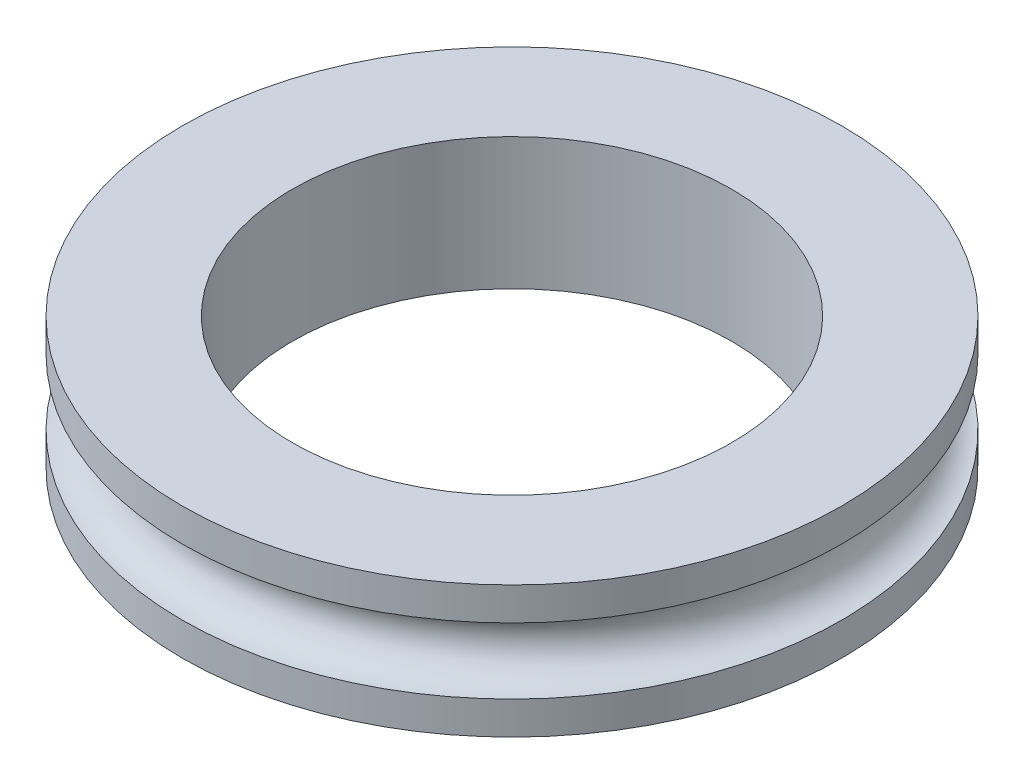
ISO-10303-21;
HEADER;
FILE_DESCRIPTION(('STEP AP214'),'2;1');
FILE_NAME('part.step','',(''),(''),'','','');
FILE_SCHEMA(('AUTOMOTIVE_DESIGN { 1 0 10303 214 1 1 1 1 }'));
ENDSEC;
DATA;
#1=APPLICATION_CONTEXT('core data for automotive mechanical design processes');
#2=APPLICATION_PROTOCOL_DEFINITION('international standard','automotive_design',2000,#1);
#3=PRODUCT_CONTEXT('',#1,'mechanical');
#4=PRODUCT('Part','Part','',(#3));
#5=PRODUCT_RELATED_PRODUCT_CATEGORY('part','',(#4));
#6=PRODUCT_DEFINITION_FORMATION('','',#4);
#7=PRODUCT_DEFINITION_CONTEXT('part definition',#1,'design');
#8=PRODUCT_DEFINITION('design','',#6,#7);
#9=PRODUCT_DEFINITION_SHAPE('','',#8);
#10=(LENGTH_UNIT() NAMED_UNIT(*) SI_UNIT(.MILLI.,.METRE.));
#11=(NAMED_UNIT(*) PLANE_ANGLE_UNIT() SI_UNIT($,.RADIAN.));
#12=(NAMED_UNIT(*) SI_UNIT($,.STERADIAN.) SOLID_ANGLE_UNIT());
#13=UNCERTAINTY_MEASURE_WITH_UNIT(LENGTH_MEASURE(1.E-05),#10,'distance_accuracy_value','');
#14=(GEOMETRIC_REPRESENTATION_CONTEXT(3) GLOBAL_UNCERTAINTY_ASSIGNED_CONTEXT((#13)) GLOBAL_UNIT_ASSIGNED_CONTEXT((#10,
#11,#12)) REPRESENTATION_CONTEXT('',''));
#15=CARTESIAN_POINT('',(0.,0.,0.));
#16=DIRECTION('',(0.,0.,1.));
#17=DIRECTION('',(1.,0.,0.));
#18=AXIS2_PLACEMENT_3D('',#15,#16,#17);
#19=CARTESIAN_POINT('',(0.,3.,0.));
#20=DIRECTION('',(0.,-1.,0.));
#21=DIRECTION('',(0.,0.,-1.));
#22=AXIS2_PLACEMENT_3D('',#19,#20,#21);
#23=CYLINDRICAL_SURFACE('',#22,7.5);
#24=CARTESIAN_POINT('',(0.,3.,0.));
#25=DIRECTION('',(0.,1.,0.));
#26=DIRECTION('',(0.,0.,1.));
#27=AXIS2_PLACEMENT_3D('',#24,#25,#26);
#28=CIRCLE('',#27,7.5);
#29=CARTESIAN_POINT('',(0.,3.,7.5));
#30=VERTEX_POINT('',#29);
#31=EDGE_CURVE('E10',#30,#30,#28,.T.);
#32=ORIENTED_EDGE('',*,*,#31,.F.);
#33=EDGE_LOOP('',(#32));
#34=FACE_BOUND('',#33,.T.);
#35=CARTESIAN_POINT('',(0.,2.25,0.));
#36=DIRECTION('',(0.,-1.,0.));
#37=DIRECTION('',(0.,0.,-1.));
#38=AXIS2_PLACEMENT_3D('',#35,#36,#37);
#39=CIRCLE('',#38,7.5);
#40=CARTESIAN_POINT('',(0.,2.25,-7.5));
#41=VERTEX_POINT('',#40);
#42=EDGE_CURVE('E34',#41,#41,#39,.T.);
#43=ORIENTED_EDGE('',*,*,#42,.F.);
#44=EDGE_LOOP('',(#43));
#45=FACE_BOUND('',#44,.T.);
#46=ADVANCED_FACE('F31',(#34,#45),#23,.T.);
#47=CARTESIAN_POINT('',(0.,3.,0.));
#48=DIRECTION('',(0.,1.,0.));
#49=DIRECTION('',(0.,0.,1.));
#50=AXIS2_PLACEMENT_3D('',#47,#48,#49);
#51=PLANE('',#50);
#52=CARTESIAN_POINT('',(0.,3.,0.));
#53=DIRECTION('',(0.,-1.,0.));
#54=DIRECTION('',(0.,0.,-1.));
#55=AXIS2_PLACEMENT_3D('',#52,#53,#54);
#56=CIRCLE('',#55,5.);
#57=CARTESIAN_POINT('',(0.,3.,-5.));
#58=VERTEX_POINT('',#57);
#59=EDGE_CURVE('E49',#58,#58,#56,.T.);
#60=ORIENTED_EDGE('',*,*,#59,.T.);
#61=EDGE_LOOP('',(#60));
#62=FACE_BOUND('',#61,.T.);
#63=ORIENTED_EDGE('',*,*,#31,.T.);
#64=EDGE_LOOP('',(#63));
#65=FACE_BOUND('',#64,.T.);
#66=ADVANCED_FACE('F76',(#62,#65),#51,.T.);
#67=CARTESIAN_POINT('',(0.,1.5,0.));
#68=DIRECTION('',(0.,1.,0.));
#69=DIRECTION('',(0.,0.,1.));
#70=AXIS2_PLACEMENT_3D('',#67,#68,#69);
#71=TOROIDAL_SURFACE('',#70,7.5,0.75);
#72=CARTESIAN_POINT('',(0.,0.749999999999999,0.));
#73=DIRECTION('',(0.,1.,0.));
#74=DIRECTION('',(0.,0.,1.));
#75=AXIS2_PLACEMENT_3D('',#72,#73,#74);
#76=CIRCLE('',#75,7.5);
#77=CARTESIAN_POINT('',(0.,0.749999999999999,7.5));
#78=VERTEX_POINT('',#77);
#79=EDGE_CURVE('E47',#78,#78,#76,.T.);
#80=ORIENTED_EDGE('',*,*,#79,.T.);
#81=EDGE_LOOP('',(#80));
#82=FACE_BOUND('',#81,.T.);
#83=ORIENTED_EDGE('',*,*,#42,.T.);
#84=EDGE_LOOP('',(#83));
#85=FACE_BOUND('',#84,.T.);
#86=ADVANCED_FACE('F65',(#82,#85),#71,.F.);
#87=CARTESIAN_POINT('',(0.,0.,0.));
#88=DIRECTION('',(0.,1.,0.));
#89=DIRECTION('',(0.,0.,1.));
#90=AXIS2_PLACEMENT_3D('',#87,#88,#89);
#91=PLANE('',#90);
#92=CARTESIAN_POINT('',(0.,0.,0.));
#93=DIRECTION('',(0.,-1.,0.));
#94=DIRECTION('',(0.,0.,-1.));
#95=AXIS2_PLACEMENT_3D('',#92,#93,#94);
#96=CIRCLE('',#95,5.);
#97=CARTESIAN_POINT('',(0.,0.,-5.));
#98=VERTEX_POINT('',#97);
#99=EDGE_CURVE('E45',#98,#98,#96,.T.);
#100=ORIENTED_EDGE('',*,*,#99,.F.);
#101=EDGE_LOOP('',(#100));
#102=FACE_BOUND('',#101,.T.);
#103=CARTESIAN_POINT('',(0.,0.,0.));
#104=DIRECTION('',(0.,1.,0.));
#105=DIRECTION('',(0.,0.,1.));
#106=AXIS2_PLACEMENT_3D('',#103,#104,#105);
#107=CIRCLE('',#106,7.5);
#108=CARTESIAN_POINT('',(0.,0.,7.5));
#109=VERTEX_POINT('',#108);
#110=EDGE_CURVE('E38',#109,#109,#107,.T.);
#111=ORIENTED_EDGE('',*,*,#110,.F.);
#112=EDGE_LOOP('',(#111));
#113=FACE_BOUND('',#112,.T.);
#114=ADVANCED_FACE('F61',(#102,#113),#91,.F.);
#115=ORIENTED_EDGE('',*,*,#110,.T.);
#116=EDGE_LOOP('',(#115));
#117=FACE_BOUND('',#116,.T.);
#118=ORIENTED_EDGE('',*,*,#79,.F.);
#119=EDGE_LOOP('',(#118));
#120=FACE_BOUND('',#119,.T.);
#121=ADVANCED_FACE('F64',(#117,#120),#23,.T.);
#122=CARTESIAN_POINT('',(0.,3.,0.));
#123=DIRECTION('',(0.,-1.,0.));
#124=DIRECTION('',(0.,0.,-1.));
#125=AXIS2_PLACEMENT_3D('',#122,#123,#124);
#126=CYLINDRICAL_SURFACE('',#125,5.);
#127=ORIENTED_EDGE('',*,*,#59,.F.);
#128=EDGE_LOOP('',(#127));
#129=FACE_BOUND('',#128,.T.);
#130=ORIENTED_EDGE('',*,*,#99,.T.);
#131=EDGE_LOOP('',(#130));
#132=FACE_BOUND('',#131,.T.);
#133=ADVANCED_FACE('F59',(#129,#132),#126,.F.);
#134=CLOSED_SHELL('',(#46,#66,#86,#114,#121,#133));
#135=MANIFOLD_SOLID_BREP('B2',#134);
#136=ADVANCED_BREP_SHAPE_REPRESENTATION('',(#18,#135),#14);
#137=SHAPE_DEFINITION_REPRESENTATION(#9,#136);
ENDSEC;
END-ISO-10303-21;
